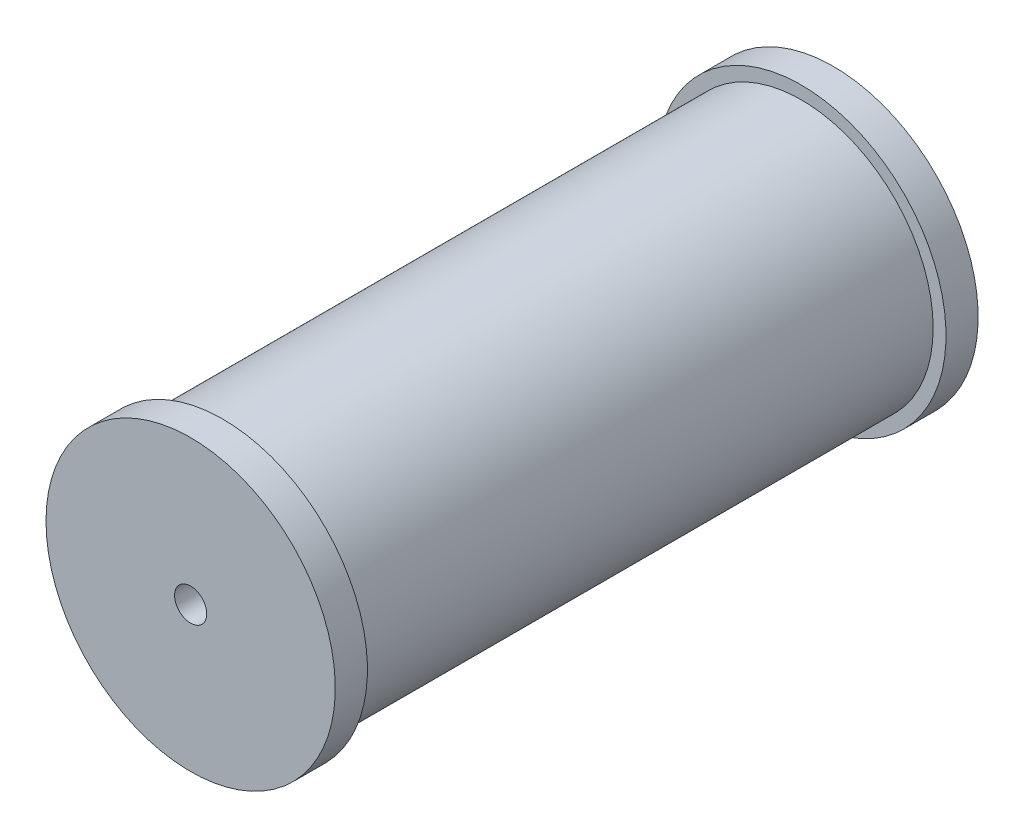
ISO-10303-21;
HEADER;
FILE_DESCRIPTION(('STEP AP214'),'2;1');
FILE_NAME('part.step','',(''),(''),'','','');
FILE_SCHEMA(('AUTOMOTIVE_DESIGN { 1 0 10303 214 1 1 1 1 }'));
ENDSEC;
DATA;
#1=APPLICATION_CONTEXT('core data for automotive mechanical design processes');
#2=APPLICATION_PROTOCOL_DEFINITION('international standard','automotive_design',2000,#1);
#3=PRODUCT_CONTEXT('',#1,'mechanical');
#4=PRODUCT('Part','Part','',(#3));
#5=PRODUCT_RELATED_PRODUCT_CATEGORY('part','',(#4));
#6=PRODUCT_DEFINITION_FORMATION('','',#4);
#7=PRODUCT_DEFINITION_CONTEXT('part definition',#1,'design');
#8=PRODUCT_DEFINITION('design','',#6,#7);
#9=PRODUCT_DEFINITION_SHAPE('','',#8);
#10=(LENGTH_UNIT() NAMED_UNIT(*) SI_UNIT(.MILLI.,.METRE.));
#11=(NAMED_UNIT(*) PLANE_ANGLE_UNIT() SI_UNIT($,.RADIAN.));
#12=(NAMED_UNIT(*) SI_UNIT($,.STERADIAN.) SOLID_ANGLE_UNIT());
#13=UNCERTAINTY_MEASURE_WITH_UNIT(LENGTH_MEASURE(1.E-05),#10,'distance_accuracy_value','');
#14=(GEOMETRIC_REPRESENTATION_CONTEXT(3) GLOBAL_UNCERTAINTY_ASSIGNED_CONTEXT((#13)) GLOBAL_UNIT_ASSIGNED_CONTEXT((#10,
#11,#12)) REPRESENTATION_CONTEXT('',''));
#15=CARTESIAN_POINT('',(0.,0.,0.));
#16=DIRECTION('',(0.,0.,1.));
#17=DIRECTION('',(1.,0.,0.));
#18=AXIS2_PLACEMENT_3D('',#15,#16,#17);
#19=CARTESIAN_POINT('',(0.,0.,100.));
#20=DIRECTION('',(0.,0.,-1.));
#21=DIRECTION('',(-1.,0.,0.));
#22=AXIS2_PLACEMENT_3D('',#19,#20,#21);
#23=CYLINDRICAL_SURFACE('',#22,2.5);
#24=CARTESIAN_POINT('',(0.,0.,100.));
#25=DIRECTION('',(0.,0.,-1.));
#26=DIRECTION('',(-1.,0.,0.));
#27=AXIS2_PLACEMENT_3D('',#24,#25,#26);
#28=CIRCLE('',#27,2.5);
#29=CARTESIAN_POINT('',(-2.5,0.,100.));
#30=VERTEX_POINT('',#29);
#31=EDGE_CURVE('E40',#30,#30,#28,.T.);
#32=ORIENTED_EDGE('',*,*,#31,.F.);
#33=EDGE_LOOP('',(#32));
#34=FACE_BOUND('',#33,.T.);
#35=CARTESIAN_POINT('',(0.,0.,0.));
#36=DIRECTION('',(0.,0.,-1.));
#37=DIRECTION('',(-1.,0.,0.));
#38=AXIS2_PLACEMENT_3D('',#35,#36,#37);
#39=CIRCLE('',#38,2.5);
#40=CARTESIAN_POINT('',(-2.5,0.,0.));
#41=VERTEX_POINT('',#40);
#42=EDGE_CURVE('E18',#41,#41,#39,.T.);
#43=ORIENTED_EDGE('',*,*,#42,.T.);
#44=EDGE_LOOP('',(#43));
#45=FACE_BOUND('',#44,.T.);
#46=ADVANCED_FACE('F15',(#34,#45),#23,.F.);
#47=CARTESIAN_POINT('',(0.,0.,0.));
#48=DIRECTION('',(0.,0.,1.));
#49=DIRECTION('',(1.,0.,0.));
#50=AXIS2_PLACEMENT_3D('',#47,#48,#49);
#51=PLANE('',#50);
#52=ORIENTED_EDGE('',*,*,#42,.F.);
#53=EDGE_LOOP('',(#52));
#54=FACE_BOUND('',#53,.T.);
#55=CARTESIAN_POINT('',(0.,0.,0.));
#56=DIRECTION('',(0.,0.,-1.));
#57=DIRECTION('',(-1.,0.,0.));
#58=AXIS2_PLACEMENT_3D('',#55,#56,#57);
#59=CIRCLE('',#58,22.5);
#60=CARTESIAN_POINT('',(-22.5,0.,0.));
#61=VERTEX_POINT('',#60);
#62=EDGE_CURVE('E38',#61,#61,#59,.F.);
#63=ORIENTED_EDGE('',*,*,#62,.F.);
#64=EDGE_LOOP('',(#63));
#65=FACE_BOUND('',#64,.T.);
#66=ADVANCED_FACE('F48',(#54,#65),#51,.F.);
#67=CARTESIAN_POINT('',(0.,0.,100.));
#68=DIRECTION('',(0.,0.,1.));
#69=DIRECTION('',(1.,0.,0.));
#70=AXIS2_PLACEMENT_3D('',#67,#68,#69);
#71=PLANE('',#70);
#72=ORIENTED_EDGE('',*,*,#31,.T.);
#73=EDGE_LOOP('',(#72));
#74=FACE_BOUND('',#73,.T.);
#75=CARTESIAN_POINT('',(0.,0.,100.));
#76=DIRECTION('',(0.,0.,-1.));
#77=DIRECTION('',(-1.,0.,0.));
#78=AXIS2_PLACEMENT_3D('',#75,#76,#77);
#79=CIRCLE('',#78,22.5);
#80=CARTESIAN_POINT('',(-22.5,0.,100.));
#81=VERTEX_POINT('',#80);
#82=EDGE_CURVE('E35',#81,#81,#79,.T.);
#83=ORIENTED_EDGE('',*,*,#82,.F.);
#84=EDGE_LOOP('',(#83));
#85=FACE_BOUND('',#84,.T.);
#86=ADVANCED_FACE('F51',(#74,#85),#71,.T.);
#87=CARTESIAN_POINT('',(0.,0.,100.));
#88=DIRECTION('',(0.,0.,-1.));
#89=DIRECTION('',(-1.,0.,0.));
#90=AXIS2_PLACEMENT_3D('',#87,#88,#89);
#91=CYLINDRICAL_SURFACE('',#90,22.5);
#92=ORIENTED_EDGE('',*,*,#62,.T.);
#93=EDGE_LOOP('',(#92));
#94=FACE_BOUND('',#93,.T.);
#95=CARTESIAN_POINT('',(0.,0.,5.));
#96=DIRECTION('',(0.,0.,-1.));
#97=DIRECTION('',(-1.,0.,0.));
#98=AXIS2_PLACEMENT_3D('',#95,#96,#97);
#99=CIRCLE('',#98,22.5);
#100=CARTESIAN_POINT('',(-22.5,0.,5.));
#101=VERTEX_POINT('',#100);
#102=EDGE_CURVE('E32',#101,#101,#99,.F.);
#103=ORIENTED_EDGE('',*,*,#102,.F.);
#104=EDGE_LOOP('',(#103));
#105=FACE_BOUND('',#104,.T.);
#106=ADVANCED_FACE('F54',(#94,#105),#91,.T.);
#107=CARTESIAN_POINT('',(0.,0.,100.));
#108=DIRECTION('',(0.,0.,-1.));
#109=DIRECTION('',(-1.,0.,0.));
#110=AXIS2_PLACEMENT_3D('',#107,#108,#109);
#111=CYLINDRICAL_SURFACE('',#110,22.5);
#112=ORIENTED_EDGE('',*,*,#82,.T.);
#113=EDGE_LOOP('',(#112));
#114=FACE_BOUND('',#113,.T.);
#115=CARTESIAN_POINT('',(0.,0.,95.));
#116=DIRECTION('',(0.,0.,-1.));
#117=DIRECTION('',(-1.,0.,0.));
#118=AXIS2_PLACEMENT_3D('',#115,#116,#117);
#119=CIRCLE('',#118,22.5);
#120=CARTESIAN_POINT('',(-22.5,0.,95.));
#121=VERTEX_POINT('',#120);
#122=EDGE_CURVE('E27',#121,#121,#119,.F.);
#123=ORIENTED_EDGE('',*,*,#122,.T.);
#124=EDGE_LOOP('',(#123));
#125=FACE_BOUND('',#124,.T.);
#126=ADVANCED_FACE('F57',(#114,#125),#111,.T.);
#127=CARTESIAN_POINT('',(0.,0.,5.));
#128=DIRECTION('',(0.,0.,1.));
#129=DIRECTION('',(1.,0.,0.));
#130=AXIS2_PLACEMENT_3D('',#127,#128,#129);
#131=PLANE('',#130);
#132=ORIENTED_EDGE('',*,*,#102,.T.);
#133=EDGE_LOOP('',(#132));
#134=FACE_BOUND('',#133,.T.);
#135=CARTESIAN_POINT('',(0.,0.,5.));
#136=DIRECTION('',(0.,0.,1.));
#137=DIRECTION('',(1.,0.,0.));
#138=AXIS2_PLACEMENT_3D('',#135,#136,#137);
#139=CIRCLE('',#138,20.5);
#140=CARTESIAN_POINT('',(20.5,0.,5.));
#141=VERTEX_POINT('',#140);
#142=EDGE_CURVE('E22',#141,#141,#139,.T.);
#143=ORIENTED_EDGE('',*,*,#142,.F.);
#144=EDGE_LOOP('',(#143));
#145=FACE_BOUND('',#144,.T.);
#146=ADVANCED_FACE('F61',(#134,#145),#131,.T.);
#147=CARTESIAN_POINT('',(0.,0.,95.));
#148=DIRECTION('',(0.,0.,1.));
#149=DIRECTION('',(1.,0.,0.));
#150=AXIS2_PLACEMENT_3D('',#147,#148,#149);
#151=PLANE('',#150);
#152=ORIENTED_EDGE('',*,*,#122,.F.);
#153=EDGE_LOOP('',(#152));
#154=FACE_BOUND('',#153,.T.);
#155=CARTESIAN_POINT('',(0.,0.,95.));
#156=DIRECTION('',(0.,0.,1.));
#157=DIRECTION('',(1.,0.,0.));
#158=AXIS2_PLACEMENT_3D('',#155,#156,#157);
#159=CIRCLE('',#158,20.5);
#160=CARTESIAN_POINT('',(20.5,0.,95.));
#161=VERTEX_POINT('',#160);
#162=EDGE_CURVE('E10',#161,#161,#159,.F.);
#163=ORIENTED_EDGE('',*,*,#162,.F.);
#164=EDGE_LOOP('',(#163));
#165=FACE_BOUND('',#164,.T.);
#166=ADVANCED_FACE('F64',(#154,#165),#151,.F.);
#167=CARTESIAN_POINT('',(0.,0.,5.));
#168=DIRECTION('',(0.,0.,1.));
#169=DIRECTION('',(1.,0.,0.));
#170=AXIS2_PLACEMENT_3D('',#167,#168,#169);
#171=CYLINDRICAL_SURFACE('',#170,20.5);
#172=ORIENTED_EDGE('',*,*,#162,.T.);
#173=EDGE_LOOP('',(#172));
#174=FACE_BOUND('',#173,.T.);
#175=ORIENTED_EDGE('',*,*,#142,.T.);
#176=EDGE_LOOP('',(#175));
#177=FACE_BOUND('',#176,.T.);
#178=ADVANCED_FACE('F68',(#174,#177),#171,.T.);
#179=CLOSED_SHELL('',(#46,#66,#86,#106,#126,#146,#166,#178));
#180=MANIFOLD_SOLID_BREP('B1',#179);
#181=ADVANCED_BREP_SHAPE_REPRESENTATION('',(#18,#180),#14);
#182=SHAPE_DEFINITION_REPRESENTATION(#9,#181);
ENDSEC;
END-ISO-10303-21;
